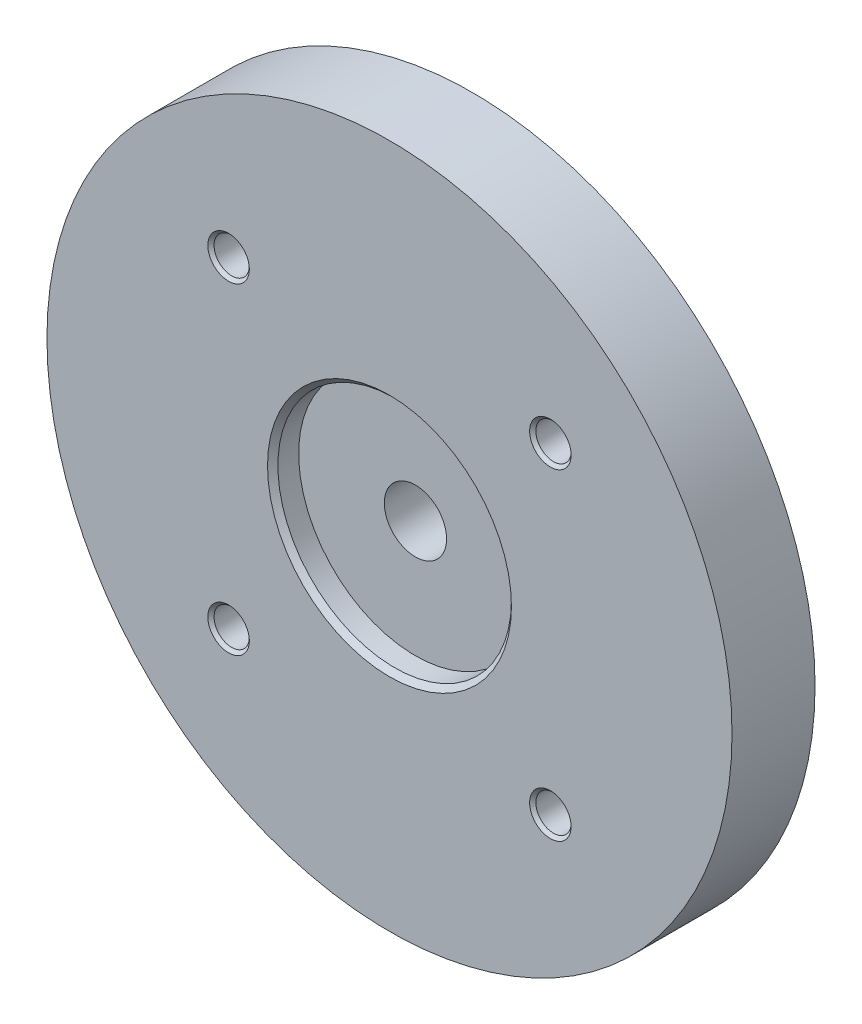
ISO-10303-21;
HEADER;
FILE_DESCRIPTION(('STEP AP214'),'2;1');
FILE_NAME('part.step','',(''),(''),'','','');
FILE_SCHEMA(('AUTOMOTIVE_DESIGN { 1 0 10303 214 1 1 1 1 }'));
ENDSEC;
DATA;
#1=APPLICATION_CONTEXT('core data for automotive mechanical design processes');
#2=APPLICATION_PROTOCOL_DEFINITION('international standard','automotive_design',2000,#1);
#3=PRODUCT_CONTEXT('',#1,'mechanical');
#4=PRODUCT('Part','Part','',(#3));
#5=PRODUCT_RELATED_PRODUCT_CATEGORY('part','',(#4));
#6=PRODUCT_DEFINITION_FORMATION('','',#4);
#7=PRODUCT_DEFINITION_CONTEXT('part definition',#1,'design');
#8=PRODUCT_DEFINITION('design','',#6,#7);
#9=PRODUCT_DEFINITION_SHAPE('','',#8);
#10=(LENGTH_UNIT() NAMED_UNIT(*) SI_UNIT(.MILLI.,.METRE.));
#11=(NAMED_UNIT(*) PLANE_ANGLE_UNIT() SI_UNIT($,.RADIAN.));
#12=(NAMED_UNIT(*) SI_UNIT($,.STERADIAN.) SOLID_ANGLE_UNIT());
#13=UNCERTAINTY_MEASURE_WITH_UNIT(LENGTH_MEASURE(1.E-05),#10,'distance_accuracy_value','');
#14=(GEOMETRIC_REPRESENTATION_CONTEXT(3) GLOBAL_UNCERTAINTY_ASSIGNED_CONTEXT((#13)) GLOBAL_UNIT_ASSIGNED_CONTEXT((#10,
#11,#12)) REPRESENTATION_CONTEXT('',''));
#15=CARTESIAN_POINT('',(0.,0.,0.));
#16=DIRECTION('',(0.,0.,1.));
#17=DIRECTION('',(1.,0.,0.));
#18=AXIS2_PLACEMENT_3D('',#15,#16,#17);
#19=CARTESIAN_POINT('',(0.,0.,-2.));
#20=DIRECTION('',(0.,0.,1.));
#21=DIRECTION('',(1.,0.,0.));
#22=AXIS2_PLACEMENT_3D('',#19,#20,#21);
#23=CYLINDRICAL_SURFACE('',#22,3.);
#24=CARTESIAN_POINT('',(0.,0.,-2.));
#25=DIRECTION('',(0.,0.,1.));
#26=DIRECTION('',(1.,0.,0.));
#27=AXIS2_PLACEMENT_3D('',#24,#25,#26);
#28=CIRCLE('',#27,3.);
#29=CARTESIAN_POINT('',(3.,0.,-2.));
#30=VERTEX_POINT('',#29);
#31=EDGE_CURVE('E112',#30,#30,#28,.T.);
#32=ORIENTED_EDGE('',*,*,#31,.F.);
#33=EDGE_LOOP('',(#32));
#34=FACE_BOUND('',#33,.T.);
#35=CARTESIAN_POINT('',(0.,0.,5.5));
#36=DIRECTION('',(0.,0.,1.));
#37=DIRECTION('',(1.,0.,0.));
#38=AXIS2_PLACEMENT_3D('',#35,#36,#37);
#39=CIRCLE('',#38,3.);
#40=CARTESIAN_POINT('',(3.,0.,5.5));
#41=VERTEX_POINT('',#40);
#42=EDGE_CURVE('E94',#41,#41,#39,.F.);
#43=ORIENTED_EDGE('',*,*,#42,.F.);
#44=EDGE_LOOP('',(#43));
#45=FACE_BOUND('',#44,.T.);
#46=ADVANCED_FACE('F44',(#34,#45),#23,.F.);
#47=CARTESIAN_POINT('',(-15.5,15.5,-2.));
#48=DIRECTION('',(0.,0.,1.));
#49=DIRECTION('',(1.,0.,0.));
#50=AXIS2_PLACEMENT_3D('',#47,#48,#49);
#51=CYLINDRICAL_SURFACE('',#50,1.7);
#52=CARTESIAN_POINT('',(-15.5,15.5,7.69999999999999));
#53=DIRECTION('',(0.,0.,1.));
#54=DIRECTION('',(1.,0.,0.));
#55=AXIS2_PLACEMENT_3D('',#52,#53,#54);
#56=CIRCLE('',#55,1.7);
#57=CARTESIAN_POINT('',(-13.8,15.5,7.69999999999999));
#58=VERTEX_POINT('',#57);
#59=EDGE_CURVE('E10',#58,#58,#56,.T.);
#60=ORIENTED_EDGE('',*,*,#59,.T.);
#61=EDGE_LOOP('',(#60));
#62=FACE_BOUND('',#61,.T.);
#63=CARTESIAN_POINT('',(-15.5,15.5,2.));
#64=DIRECTION('',(0.,0.,-1.));
#65=DIRECTION('',(-1.,0.,0.));
#66=AXIS2_PLACEMENT_3D('',#63,#64,#65);
#67=CIRCLE('',#66,1.7);
#68=CARTESIAN_POINT('',(-17.2,15.5,2.));
#69=VERTEX_POINT('',#68);
#70=EDGE_CURVE('E125',#69,#69,#67,.F.);
#71=ORIENTED_EDGE('',*,*,#70,.F.);
#72=EDGE_LOOP('',(#71));
#73=FACE_BOUND('',#72,.T.);
#74=ADVANCED_FACE('F225',(#62,#73),#51,.F.);
#75=CARTESIAN_POINT('',(15.5,15.5,-2.));
#76=DIRECTION('',(0.,0.,1.));
#77=DIRECTION('',(1.,0.,0.));
#78=AXIS2_PLACEMENT_3D('',#75,#76,#77);
#79=CYLINDRICAL_SURFACE('',#78,1.7);
#80=CARTESIAN_POINT('',(15.5,15.5,7.69999999999998));
#81=DIRECTION('',(0.,0.,1.));
#82=DIRECTION('',(1.,0.,0.));
#83=AXIS2_PLACEMENT_3D('',#80,#81,#82);
#84=CIRCLE('',#83,1.7);
#85=CARTESIAN_POINT('',(17.2,15.5,7.69999999999998));
#86=VERTEX_POINT('',#85);
#87=EDGE_CURVE('E53',#86,#86,#84,.T.);
#88=ORIENTED_EDGE('',*,*,#87,.T.);
#89=EDGE_LOOP('',(#88));
#90=FACE_BOUND('',#89,.T.);
#91=CARTESIAN_POINT('',(15.5,15.5,2.));
#92=DIRECTION('',(0.,0.,-1.));
#93=DIRECTION('',(-1.,0.,0.));
#94=AXIS2_PLACEMENT_3D('',#91,#92,#93);
#95=CIRCLE('',#94,1.7);
#96=CARTESIAN_POINT('',(13.8,15.5,2.));
#97=VERTEX_POINT('',#96);
#98=EDGE_CURVE('E129',#97,#97,#95,.F.);
#99=ORIENTED_EDGE('',*,*,#98,.F.);
#100=EDGE_LOOP('',(#99));
#101=FACE_BOUND('',#100,.T.);
#102=ADVANCED_FACE('F232',(#90,#101),#79,.F.);
#103=CARTESIAN_POINT('',(15.5,-15.5,-2.));
#104=DIRECTION('',(0.,0.,1.));
#105=DIRECTION('',(1.,0.,0.));
#106=AXIS2_PLACEMENT_3D('',#103,#104,#105);
#107=CYLINDRICAL_SURFACE('',#106,1.7);
#108=CARTESIAN_POINT('',(15.5,-15.5,7.69999999999998));
#109=DIRECTION('',(0.,0.,1.));
#110=DIRECTION('',(1.,0.,0.));
#111=AXIS2_PLACEMENT_3D('',#108,#109,#110);
#112=CIRCLE('',#111,1.7);
#113=CARTESIAN_POINT('',(17.2,-15.5,7.69999999999998));
#114=VERTEX_POINT('',#113);
#115=EDGE_CURVE('E58',#114,#114,#112,.T.);
#116=ORIENTED_EDGE('',*,*,#115,.T.);
#117=EDGE_LOOP('',(#116));
#118=FACE_BOUND('',#117,.T.);
#119=CARTESIAN_POINT('',(15.5,-15.5,2.));
#120=DIRECTION('',(0.,0.,-1.));
#121=DIRECTION('',(-1.,0.,0.));
#122=AXIS2_PLACEMENT_3D('',#119,#120,#121);
#123=CIRCLE('',#122,1.7);
#124=CARTESIAN_POINT('',(13.8,-15.5,2.));
#125=VERTEX_POINT('',#124);
#126=EDGE_CURVE('E133',#125,#125,#123,.F.);
#127=ORIENTED_EDGE('',*,*,#126,.F.);
#128=EDGE_LOOP('',(#127));
#129=FACE_BOUND('',#128,.T.);
#130=ADVANCED_FACE('F520',(#118,#129),#107,.F.);
#131=CARTESIAN_POINT('',(-15.5,-15.5,-2.));
#132=DIRECTION('',(0.,0.,1.));
#133=DIRECTION('',(1.,0.,0.));
#134=AXIS2_PLACEMENT_3D('',#131,#132,#133);
#135=CYLINDRICAL_SURFACE('',#134,1.7);
#136=CARTESIAN_POINT('',(-15.5,-15.5,7.69999999999998));
#137=DIRECTION('',(0.,0.,1.));
#138=DIRECTION('',(1.,0.,0.));
#139=AXIS2_PLACEMENT_3D('',#136,#137,#138);
#140=CIRCLE('',#139,1.7);
#141=CARTESIAN_POINT('',(-13.8,-15.5,7.69999999999998));
#142=VERTEX_POINT('',#141);
#143=EDGE_CURVE('E81',#142,#142,#140,.T.);
#144=ORIENTED_EDGE('',*,*,#143,.T.);
#145=EDGE_LOOP('',(#144));
#146=FACE_BOUND('',#145,.T.);
#147=CARTESIAN_POINT('',(-15.5,-15.5,2.));
#148=DIRECTION('',(0.,0.,-1.));
#149=DIRECTION('',(-1.,0.,0.));
#150=AXIS2_PLACEMENT_3D('',#147,#148,#149);
#151=CIRCLE('',#150,1.7);
#152=CARTESIAN_POINT('',(-17.2,-15.5,2.));
#153=VERTEX_POINT('',#152);
#154=EDGE_CURVE('E137',#153,#153,#151,.F.);
#155=ORIENTED_EDGE('',*,*,#154,.F.);
#156=EDGE_LOOP('',(#155));
#157=FACE_BOUND('',#156,.T.);
#158=ADVANCED_FACE('F237',(#146,#157),#135,.F.);
#159=CARTESIAN_POINT('',(0.,0.,8.));
#160=DIRECTION('',(0.,0.,-1.));
#161=DIRECTION('',(-1.,0.,0.));
#162=AXIS2_PLACEMENT_3D('',#159,#160,#161);
#163=CYLINDRICAL_SURFACE('',#162,33.);
#164=CARTESIAN_POINT('',(0.,0.,8.));
#165=DIRECTION('',(0.,0.,1.));
#166=DIRECTION('',(1.,0.,0.));
#167=AXIS2_PLACEMENT_3D('',#164,#165,#166);
#168=CIRCLE('',#167,33.);
#169=CARTESIAN_POINT('',(33.,0.,8.));
#170=VERTEX_POINT('',#169);
#171=EDGE_CURVE('E107',#170,#170,#168,.T.);
#172=ORIENTED_EDGE('',*,*,#171,.F.);
#173=EDGE_LOOP('',(#172));
#174=FACE_BOUND('',#173,.T.);
#175=CARTESIAN_POINT('',(0.,0.,0.));
#176=DIRECTION('',(0.,0.,1.));
#177=DIRECTION('',(1.,0.,0.));
#178=AXIS2_PLACEMENT_3D('',#175,#176,#177);
#179=CIRCLE('',#178,33.);
#180=CARTESIAN_POINT('',(33.,0.,0.));
#181=VERTEX_POINT('',#180);
#182=EDGE_CURVE('E142',#181,#181,#179,.T.);
#183=ORIENTED_EDGE('',*,*,#182,.T.);
#184=EDGE_LOOP('',(#183));
#185=FACE_BOUND('',#184,.T.);
#186=ADVANCED_FACE('F253',(#174,#185),#163,.T.);
#187=CARTESIAN_POINT('',(0.,0.,8.));
#188=DIRECTION('',(0.,0.,1.));
#189=DIRECTION('',(1.,0.,0.));
#190=AXIS2_PLACEMENT_3D('',#187,#188,#189);
#191=PLANE('',#190);
#192=CARTESIAN_POINT('',(-15.5,-15.5,8.));
#193=DIRECTION('',(0.,0.,1.));
#194=DIRECTION('',(1.,0.,0.));
#195=AXIS2_PLACEMENT_3D('',#192,#193,#194);
#196=CIRCLE('',#195,2.00000000000001);
#197=CARTESIAN_POINT('',(-13.5,-15.5,8.));
#198=VERTEX_POINT('',#197);
#199=EDGE_CURVE('E63',#198,#198,#196,.F.);
#200=ORIENTED_EDGE('',*,*,#199,.T.);
#201=EDGE_LOOP('',(#200));
#202=FACE_BOUND('',#201,.T.);
#203=CARTESIAN_POINT('',(15.5,-15.5,8.));
#204=DIRECTION('',(0.,0.,1.));
#205=DIRECTION('',(1.,0.,0.));
#206=AXIS2_PLACEMENT_3D('',#203,#204,#205);
#207=CIRCLE('',#206,2.00000000000002);
#208=CARTESIAN_POINT('',(17.5,-15.5,8.));
#209=VERTEX_POINT('',#208);
#210=EDGE_CURVE('E69',#209,#209,#207,.F.);
#211=ORIENTED_EDGE('',*,*,#210,.T.);
#212=EDGE_LOOP('',(#211));
#213=FACE_BOUND('',#212,.T.);
#214=CARTESIAN_POINT('',(15.5,15.5,8.));
#215=DIRECTION('',(0.,0.,1.));
#216=DIRECTION('',(1.,0.,0.));
#217=AXIS2_PLACEMENT_3D('',#214,#215,#216);
#218=CIRCLE('',#217,2.00000000000002);
#219=CARTESIAN_POINT('',(17.5,15.5,8.));
#220=VERTEX_POINT('',#219);
#221=EDGE_CURVE('E73',#220,#220,#218,.F.);
#222=ORIENTED_EDGE('',*,*,#221,.T.);
#223=EDGE_LOOP('',(#222));
#224=FACE_BOUND('',#223,.T.);
#225=CARTESIAN_POINT('',(-15.5,15.5,8.));
#226=DIRECTION('',(0.,0.,1.));
#227=DIRECTION('',(1.,0.,0.));
#228=AXIS2_PLACEMENT_3D('',#225,#226,#227);
#229=CIRCLE('',#228,2.00000000000002);
#230=CARTESIAN_POINT('',(-13.5,15.5,8.));
#231=VERTEX_POINT('',#230);
#232=EDGE_CURVE('E77',#231,#231,#229,.F.);
#233=ORIENTED_EDGE('',*,*,#232,.T.);
#234=EDGE_LOOP('',(#233));
#235=FACE_BOUND('',#234,.T.);
#236=CARTESIAN_POINT('',(0.,0.,8.));
#237=DIRECTION('',(0.,0.,1.));
#238=DIRECTION('',(1.,0.,0.));
#239=AXIS2_PLACEMENT_3D('',#236,#237,#238);
#240=CIRCLE('',#239,11.75);
#241=CARTESIAN_POINT('',(11.75,0.,8.));
#242=VERTEX_POINT('',#241);
#243=EDGE_CURVE('E85',#242,#242,#240,.F.);
#244=ORIENTED_EDGE('',*,*,#243,.T.);
#245=EDGE_LOOP('',(#244));
#246=FACE_BOUND('',#245,.T.);
#247=ORIENTED_EDGE('',*,*,#171,.T.);
#248=EDGE_LOOP('',(#247));
#249=FACE_BOUND('',#248,.T.);
#250=ADVANCED_FACE('F250',(#202,#213,#224,#235,#246,#249),#191,.T.);
#251=CARTESIAN_POINT('',(0.,0.,0.));
#252=DIRECTION('',(0.,0.,1.));
#253=DIRECTION('',(1.,0.,0.));
#254=AXIS2_PLACEMENT_3D('',#251,#252,#253);
#255=PLANE('',#254);
#256=CARTESIAN_POINT('',(0.,0.,0.));
#257=DIRECTION('',(0.,0.,1.));
#258=DIRECTION('',(1.,0.,0.));
#259=AXIS2_PLACEMENT_3D('',#256,#257,#258);
#260=CIRCLE('',#259,11.);
#261=CARTESIAN_POINT('',(11.,0.,0.));
#262=VERTEX_POINT('',#261);
#263=EDGE_CURVE('E93',#262,#262,#260,.T.);
#264=ORIENTED_EDGE('',*,*,#263,.T.);
#265=EDGE_LOOP('',(#264));
#266=FACE_BOUND('',#265,.T.);
#267=CARTESIAN_POINT('',(0.,29.5,0.));
#268=DIRECTION('',(0.,0.,-1.));
#269=DIRECTION('',(-1.,0.,0.));
#270=AXIS2_PLACEMENT_3D('',#267,#268,#269);
#271=CIRCLE('',#270,2.1);
#272=CARTESIAN_POINT('',(-2.1,29.5,0.));
#273=VERTEX_POINT('',#272);
#274=EDGE_CURVE('E195',#273,#273,#271,.T.);
#275=ORIENTED_EDGE('',*,*,#274,.F.);
#276=EDGE_LOOP('',(#275));
#277=FACE_BOUND('',#276,.T.);
#278=CARTESIAN_POINT('',(-29.5,-5.65519853168439E-13,0.));
#279=DIRECTION('',(0.,0.,-1.));
#280=DIRECTION('',(-1.,0.,0.));
#281=AXIS2_PLACEMENT_3D('',#278,#279,#280);
#282=CIRCLE('',#281,2.1);
#283=CARTESIAN_POINT('',(-31.6,-5.65519853168439E-13,0.));
#284=VERTEX_POINT('',#283);
#285=EDGE_CURVE('E191',#284,#284,#282,.T.);
#286=ORIENTED_EDGE('',*,*,#285,.F.);
#287=EDGE_LOOP('',(#286));
#288=FACE_BOUND('',#287,.T.);
#289=CARTESIAN_POINT('',(6.96595987118696E-13,-29.5,0.));
#290=DIRECTION('',(0.,0.,-1.));
#291=DIRECTION('',(-1.,0.,0.));
#292=AXIS2_PLACEMENT_3D('',#289,#290,#291);
#293=CIRCLE('',#292,2.1);
#294=CARTESIAN_POINT('',(-2.0999999999993,-29.5,0.));
#295=VERTEX_POINT('',#294);
#296=EDGE_CURVE('E183',#295,#295,#293,.T.);
#297=ORIENTED_EDGE('',*,*,#296,.F.);
#298=EDGE_LOOP('',(#297));
#299=FACE_BOUND('',#298,.T.);
#300=CARTESIAN_POINT('',(29.5000000000006,0.,0.));
#301=DIRECTION('',(0.,0.,-1.));
#302=DIRECTION('',(-1.,0.,0.));
#303=AXIS2_PLACEMENT_3D('',#300,#301,#302);
#304=CIRCLE('',#303,2.10000000000062);
#305=CARTESIAN_POINT('',(27.3999999999999,0.,0.));
#306=VERTEX_POINT('',#305);
#307=EDGE_CURVE('E175',#306,#306,#304,.T.);
#308=ORIENTED_EDGE('',*,*,#307,.F.);
#309=EDGE_LOOP('',(#308));
#310=FACE_BOUND('',#309,.T.);
#311=CARTESIAN_POINT('',(15.5,-15.5,0.));
#312=DIRECTION('',(0.,0.,1.));
#313=DIRECTION('',(1.,0.,0.));
#314=AXIS2_PLACEMENT_3D('',#311,#312,#313);
#315=CIRCLE('',#314,2.8);
#316=CARTESIAN_POINT('',(18.3,-15.5,0.));
#317=VERTEX_POINT('',#316);
#318=EDGE_CURVE('E108',#317,#317,#315,.F.);
#319=ORIENTED_EDGE('',*,*,#318,.F.);
#320=EDGE_LOOP('',(#319));
#321=FACE_BOUND('',#320,.T.);
#322=CARTESIAN_POINT('',(-15.5,-15.5,0.));
#323=DIRECTION('',(0.,0.,1.));
#324=DIRECTION('',(1.,0.,0.));
#325=AXIS2_PLACEMENT_3D('',#322,#323,#324);
#326=CIRCLE('',#325,2.8);
#327=CARTESIAN_POINT('',(-12.7,-15.5,0.));
#328=VERTEX_POINT('',#327);
#329=EDGE_CURVE('E113',#328,#328,#326,.F.);
#330=ORIENTED_EDGE('',*,*,#329,.F.);
#331=EDGE_LOOP('',(#330));
#332=FACE_BOUND('',#331,.T.);
#333=CARTESIAN_POINT('',(-15.5,15.5,0.));
#334=DIRECTION('',(0.,0.,1.));
#335=DIRECTION('',(1.,0.,0.));
#336=AXIS2_PLACEMENT_3D('',#333,#334,#335);
#337=CIRCLE('',#336,2.8);
#338=CARTESIAN_POINT('',(-12.7,15.5,0.));
#339=VERTEX_POINT('',#338);
#340=EDGE_CURVE('E117',#339,#339,#337,.F.);
#341=ORIENTED_EDGE('',*,*,#340,.F.);
#342=EDGE_LOOP('',(#341));
#343=FACE_BOUND('',#342,.T.);
#344=CARTESIAN_POINT('',(15.5,15.5,0.));
#345=DIRECTION('',(0.,0.,1.));
#346=DIRECTION('',(1.,0.,0.));
#347=AXIS2_PLACEMENT_3D('',#344,#345,#346);
#348=CIRCLE('',#347,2.8);
#349=CARTESIAN_POINT('',(18.3,15.5,0.));
#350=VERTEX_POINT('',#349);
#351=EDGE_CURVE('E121',#350,#350,#348,.F.);
#352=ORIENTED_EDGE('',*,*,#351,.F.);
#353=EDGE_LOOP('',(#352));
#354=FACE_BOUND('',#353,.T.);
#355=ORIENTED_EDGE('',*,*,#182,.F.);
#356=EDGE_LOOP('',(#355));
#357=FACE_BOUND('',#356,.T.);
#358=ADVANCED_FACE('F248',(#266,#277,#288,#299,#310,#321,#332,#343,#354,#357),#255,.F.);
#359=CARTESIAN_POINT('',(0.,0.,-2.));
#360=DIRECTION('',(0.,0.,1.));
#361=DIRECTION('',(1.,0.,0.));
#362=AXIS2_PLACEMENT_3D('',#359,#360,#361);
#363=CYLINDRICAL_SURFACE('',#362,10.);
#364=CARTESIAN_POINT('',(0.,0.,-1.));
#365=DIRECTION('',(0.,0.,1.));
#366=DIRECTION('',(1.,0.,0.));
#367=AXIS2_PLACEMENT_3D('',#364,#365,#366);
#368=CIRCLE('',#367,10.);
#369=CARTESIAN_POINT('',(10.,0.,-1.));
#370=VERTEX_POINT('',#369);
#371=EDGE_CURVE('E103',#370,#370,#368,.F.);
#372=ORIENTED_EDGE('',*,*,#371,.T.);
#373=EDGE_LOOP('',(#372));
#374=FACE_BOUND('',#373,.T.);
#375=CARTESIAN_POINT('',(0.,0.,-2.));
#376=DIRECTION('',(0.,0.,-1.));
#377=DIRECTION('',(-1.,0.,0.));
#378=AXIS2_PLACEMENT_3D('',#375,#376,#377);
#379=CIRCLE('',#378,10.);
#380=CARTESIAN_POINT('',(-10.,0.,-2.));
#381=VERTEX_POINT('',#380);
#382=EDGE_CURVE('E146',#381,#381,#379,.T.);
#383=ORIENTED_EDGE('',*,*,#382,.F.);
#384=EDGE_LOOP('',(#383));
#385=FACE_BOUND('',#384,.T.);
#386=ADVANCED_FACE('F244',(#374,#385),#363,.T.);
#387=CARTESIAN_POINT('',(0.,0.,-2.));
#388=DIRECTION('',(0.,0.,-1.));
#389=DIRECTION('',(-1.,0.,0.));
#390=AXIS2_PLACEMENT_3D('',#387,#388,#389);
#391=PLANE('',#390);
#392=ORIENTED_EDGE('',*,*,#31,.T.);
#393=EDGE_LOOP('',(#392));
#394=FACE_BOUND('',#393,.T.);
#395=ORIENTED_EDGE('',*,*,#382,.T.);
#396=EDGE_LOOP('',(#395));
#397=FACE_BOUND('',#396,.T.);
#398=ADVANCED_FACE('F240',(#394,#397),#391,.T.);
#399=CARTESIAN_POINT('',(-15.5,-15.5,-2.));
#400=DIRECTION('',(0.,0.,1.));
#401=DIRECTION('',(1.,0.,0.));
#402=AXIS2_PLACEMENT_3D('',#399,#400,#401);
#403=CYLINDRICAL_SURFACE('',#402,2.8);
#404=CARTESIAN_POINT('',(-15.5,-15.5,2.));
#405=DIRECTION('',(0.,0.,-1.));
#406=DIRECTION('',(-1.,0.,0.));
#407=AXIS2_PLACEMENT_3D('',#404,#405,#406);
#408=CIRCLE('',#407,2.8);
#409=CARTESIAN_POINT('',(-18.3,-15.5,2.));
#410=VERTEX_POINT('',#409);
#411=EDGE_CURVE('E164',#410,#410,#408,.T.);
#412=ORIENTED_EDGE('',*,*,#411,.F.);
#413=EDGE_LOOP('',(#412));
#414=FACE_BOUND('',#413,.T.);
#415=ORIENTED_EDGE('',*,*,#329,.T.);
#416=EDGE_LOOP('',(#415));
#417=FACE_BOUND('',#416,.T.);
#418=ADVANCED_FACE('F243',(#414,#417),#403,.F.);
#419=CARTESIAN_POINT('',(-15.5,-15.5,2.));
#420=DIRECTION('',(0.,0.,-1.));
#421=DIRECTION('',(-1.,0.,0.));
#422=AXIS2_PLACEMENT_3D('',#419,#420,#421);
#423=PLANE('',#422);
#424=ORIENTED_EDGE('',*,*,#411,.T.);
#425=EDGE_LOOP('',(#424));
#426=FACE_BOUND('',#425,.T.);
#427=ORIENTED_EDGE('',*,*,#154,.T.);
#428=EDGE_LOOP('',(#427));
#429=FACE_BOUND('',#428,.T.);
#430=ADVANCED_FACE('F487',(#426,#429),#423,.T.);
#431=CARTESIAN_POINT('',(15.5,-15.5,-2.));
#432=DIRECTION('',(0.,0.,1.));
#433=DIRECTION('',(1.,0.,0.));
#434=AXIS2_PLACEMENT_3D('',#431,#432,#433);
#435=CYLINDRICAL_SURFACE('',#434,2.8);
#436=CARTESIAN_POINT('',(15.5,-15.5,2.));
#437=DIRECTION('',(0.,0.,-1.));
#438=DIRECTION('',(-1.,0.,0.));
#439=AXIS2_PLACEMENT_3D('',#436,#437,#438);
#440=CIRCLE('',#439,2.8);
#441=CARTESIAN_POINT('',(12.7,-15.5,2.));
#442=VERTEX_POINT('',#441);
#443=EDGE_CURVE('E160',#442,#442,#440,.T.);
#444=ORIENTED_EDGE('',*,*,#443,.F.);
#445=EDGE_LOOP('',(#444));
#446=FACE_BOUND('',#445,.T.);
#447=ORIENTED_EDGE('',*,*,#318,.T.);
#448=EDGE_LOOP('',(#447));
#449=FACE_BOUND('',#448,.T.);
#450=ADVANCED_FACE('F477',(#446,#449),#435,.F.);
#451=CARTESIAN_POINT('',(15.5,-15.5,2.));
#452=DIRECTION('',(0.,0.,-1.));
#453=DIRECTION('',(-1.,0.,0.));
#454=AXIS2_PLACEMENT_3D('',#451,#452,#453);
#455=PLANE('',#454);
#456=ORIENTED_EDGE('',*,*,#443,.T.);
#457=EDGE_LOOP('',(#456));
#458=FACE_BOUND('',#457,.T.);
#459=ORIENTED_EDGE('',*,*,#126,.T.);
#460=EDGE_LOOP('',(#459));
#461=FACE_BOUND('',#460,.T.);
#462=ADVANCED_FACE('F467',(#458,#461),#455,.T.);
#463=CARTESIAN_POINT('',(15.5,15.5,-2.));
#464=DIRECTION('',(0.,0.,1.));
#465=DIRECTION('',(1.,0.,0.));
#466=AXIS2_PLACEMENT_3D('',#463,#464,#465);
#467=CYLINDRICAL_SURFACE('',#466,2.8);
#468=CARTESIAN_POINT('',(15.5,15.5,2.));
#469=DIRECTION('',(0.,0.,-1.));
#470=DIRECTION('',(-1.,0.,0.));
#471=AXIS2_PLACEMENT_3D('',#468,#469,#470);
#472=CIRCLE('',#471,2.8);
#473=CARTESIAN_POINT('',(12.7,15.5,2.));
#474=VERTEX_POINT('',#473);
#475=EDGE_CURVE('E141',#474,#474,#472,.T.);
#476=ORIENTED_EDGE('',*,*,#475,.F.);
#477=EDGE_LOOP('',(#476));
#478=FACE_BOUND('',#477,.T.);
#479=ORIENTED_EDGE('',*,*,#351,.T.);
#480=EDGE_LOOP('',(#479));
#481=FACE_BOUND('',#480,.T.);
#482=ADVANCED_FACE('F457',(#478,#481),#467,.F.);
#483=CARTESIAN_POINT('',(15.5,15.5,2.));
#484=DIRECTION('',(0.,0.,-1.));
#485=DIRECTION('',(-1.,0.,0.));
#486=AXIS2_PLACEMENT_3D('',#483,#484,#485);
#487=PLANE('',#486);
#488=ORIENTED_EDGE('',*,*,#475,.T.);
#489=EDGE_LOOP('',(#488));
#490=FACE_BOUND('',#489,.T.);
#491=ORIENTED_EDGE('',*,*,#98,.T.);
#492=EDGE_LOOP('',(#491));
#493=FACE_BOUND('',#492,.T.);
#494=ADVANCED_FACE('F447',(#490,#493),#487,.T.);
#495=CARTESIAN_POINT('',(-15.5,15.5,-2.));
#496=DIRECTION('',(0.,0.,1.));
#497=DIRECTION('',(1.,0.,0.));
#498=AXIS2_PLACEMENT_3D('',#495,#496,#497);
#499=CYLINDRICAL_SURFACE('',#498,2.8);
#500=CARTESIAN_POINT('',(-15.5,15.5,2.));
#501=DIRECTION('',(0.,0.,-1.));
#502=DIRECTION('',(-1.,0.,0.));
#503=AXIS2_PLACEMENT_3D('',#500,#501,#502);
#504=CIRCLE('',#503,2.8);
#505=CARTESIAN_POINT('',(-18.3,15.5,2.));
#506=VERTEX_POINT('',#505);
#507=EDGE_CURVE('E159',#506,#506,#504,.T.);
#508=ORIENTED_EDGE('',*,*,#507,.F.);
#509=EDGE_LOOP('',(#508));
#510=FACE_BOUND('',#509,.T.);
#511=ORIENTED_EDGE('',*,*,#340,.T.);
#512=EDGE_LOOP('',(#511));
#513=FACE_BOUND('',#512,.T.);
#514=ADVANCED_FACE('F437',(#510,#513),#499,.F.);
#515=CARTESIAN_POINT('',(-15.5,15.5,2.));
#516=DIRECTION('',(0.,0.,-1.));
#517=DIRECTION('',(-1.,0.,0.));
#518=AXIS2_PLACEMENT_3D('',#515,#516,#517);
#519=PLANE('',#518);
#520=ORIENTED_EDGE('',*,*,#507,.T.);
#521=EDGE_LOOP('',(#520));
#522=FACE_BOUND('',#521,.T.);
#523=ORIENTED_EDGE('',*,*,#70,.T.);
#524=EDGE_LOOP('',(#523));
#525=FACE_BOUND('',#524,.T.);
#526=ADVANCED_FACE('F427',(#522,#525),#519,.T.);
#527=CARTESIAN_POINT('',(29.5000000000006,0.,6.));
#528=DIRECTION('',(0.,0.,-1.));
#529=DIRECTION('',(-1.,0.,0.));
#530=AXIS2_PLACEMENT_3D('',#527,#528,#529);
#531=CYLINDRICAL_SURFACE('',#530,2.10000000000062);
#532=CARTESIAN_POINT('',(29.5000000000006,0.,6.));
#533=DIRECTION('',(0.,0.,-1.));
#534=DIRECTION('',(-1.,0.,0.));
#535=AXIS2_PLACEMENT_3D('',#532,#533,#534);
#536=CIRCLE('',#535,2.10000000000062);
#537=CARTESIAN_POINT('',(27.3999999999999,0.,6.));
#538=VERTEX_POINT('',#537);
#539=EDGE_CURVE('E98',#538,#538,#536,.T.);
#540=ORIENTED_EDGE('',*,*,#539,.F.);
#541=EDGE_LOOP('',(#540));
#542=FACE_BOUND('',#541,.T.);
#543=ORIENTED_EDGE('',*,*,#307,.T.);
#544=EDGE_LOOP('',(#543));
#545=FACE_BOUND('',#544,.T.);
#546=ADVANCED_FACE('F417',(#542,#545),#531,.F.);
#547=CARTESIAN_POINT('',(29.5000000000006,0.,6.));
#548=DIRECTION('',(0.,0.,-1.));
#549=DIRECTION('',(-1.,0.,0.));
#550=AXIS2_PLACEMENT_3D('',#547,#548,#549);
#551=PLANE('',#550);
#552=ORIENTED_EDGE('',*,*,#539,.T.);
#553=EDGE_LOOP('',(#552));
#554=FACE_BOUND('',#553,.T.);
#555=ADVANCED_FACE('F407',(#554),#551,.T.);
#556=CARTESIAN_POINT('',(6.96595987118696E-13,-29.5,6.));
#557=DIRECTION('',(0.,0.,-1.));
#558=DIRECTION('',(-1.,0.,0.));
#559=AXIS2_PLACEMENT_3D('',#556,#557,#558);
#560=CYLINDRICAL_SURFACE('',#559,2.1);
#561=CARTESIAN_POINT('',(6.96595987118696E-13,-29.5,6.));
#562=DIRECTION('',(0.,0.,-1.));
#563=DIRECTION('',(-1.,0.,0.));
#564=AXIS2_PLACEMENT_3D('',#561,#562,#563);
#565=CIRCLE('',#564,2.1);
#566=CARTESIAN_POINT('',(-2.0999999999993,-29.5,6.));
#567=VERTEX_POINT('',#566);
#568=EDGE_CURVE('E179',#567,#567,#565,.T.);
#569=ORIENTED_EDGE('',*,*,#568,.F.);
#570=EDGE_LOOP('',(#569));
#571=FACE_BOUND('',#570,.T.);
#572=ORIENTED_EDGE('',*,*,#296,.T.);
#573=EDGE_LOOP('',(#572));
#574=FACE_BOUND('',#573,.T.);
#575=ADVANCED_FACE('F397',(#571,#574),#560,.F.);
#576=CARTESIAN_POINT('',(6.96595987118696E-13,-29.5,6.));
#577=DIRECTION('',(0.,0.,-1.));
#578=DIRECTION('',(-1.,0.,0.));
#579=AXIS2_PLACEMENT_3D('',#576,#577,#578);
#580=PLANE('',#579);
#581=ORIENTED_EDGE('',*,*,#568,.T.);
#582=EDGE_LOOP('',(#581));
#583=FACE_BOUND('',#582,.T.);
#584=ADVANCED_FACE('F387',(#583),#580,.T.);
#585=CARTESIAN_POINT('',(-29.5,-5.65519853168439E-13,6.));
#586=DIRECTION('',(0.,0.,-1.));
#587=DIRECTION('',(-1.,0.,0.));
#588=AXIS2_PLACEMENT_3D('',#585,#586,#587);
#589=CYLINDRICAL_SURFACE('',#588,2.1);
#590=CARTESIAN_POINT('',(-29.5,-5.65519853168439E-13,6.));
#591=DIRECTION('',(0.,0.,-1.));
#592=DIRECTION('',(-1.,0.,0.));
#593=AXIS2_PLACEMENT_3D('',#590,#591,#592);
#594=CIRCLE('',#593,2.1);
#595=CARTESIAN_POINT('',(-31.6,-5.65519853168439E-13,6.));
#596=VERTEX_POINT('',#595);
#597=EDGE_CURVE('E187',#596,#596,#594,.T.);
#598=ORIENTED_EDGE('',*,*,#597,.F.);
#599=EDGE_LOOP('',(#598));
#600=FACE_BOUND('',#599,.T.);
#601=ORIENTED_EDGE('',*,*,#285,.T.);
#602=EDGE_LOOP('',(#601));
#603=FACE_BOUND('',#602,.T.);
#604=ADVANCED_FACE('F377',(#600,#603),#589,.F.);
#605=CARTESIAN_POINT('',(-29.5,-5.65519853168439E-13,6.));
#606=DIRECTION('',(0.,0.,-1.));
#607=DIRECTION('',(-1.,0.,0.));
#608=AXIS2_PLACEMENT_3D('',#605,#606,#607);
#609=PLANE('',#608);
#610=ORIENTED_EDGE('',*,*,#597,.T.);
#611=EDGE_LOOP('',(#610));
#612=FACE_BOUND('',#611,.T.);
#613=ADVANCED_FACE('F367',(#612),#609,.T.);
#614=CARTESIAN_POINT('',(0.,29.5,6.));
#615=DIRECTION('',(0.,0.,-1.));
#616=DIRECTION('',(-1.,0.,0.));
#617=AXIS2_PLACEMENT_3D('',#614,#615,#616);
#618=CYLINDRICAL_SURFACE('',#617,2.1);
#619=CARTESIAN_POINT('',(0.,29.5,6.));
#620=DIRECTION('',(0.,0.,-1.));
#621=DIRECTION('',(-1.,0.,0.));
#622=AXIS2_PLACEMENT_3D('',#619,#620,#621);
#623=CIRCLE('',#622,2.1);
#624=CARTESIAN_POINT('',(-2.1,29.5,6.));
#625=VERTEX_POINT('',#624);
#626=EDGE_CURVE('E165',#625,#625,#623,.T.);
#627=ORIENTED_EDGE('',*,*,#626,.F.);
#628=EDGE_LOOP('',(#627));
#629=FACE_BOUND('',#628,.T.);
#630=ORIENTED_EDGE('',*,*,#274,.T.);
#631=EDGE_LOOP('',(#630));
#632=FACE_BOUND('',#631,.T.);
#633=ADVANCED_FACE('F358',(#629,#632),#618,.F.);
#634=CARTESIAN_POINT('',(0.,29.5,6.));
#635=DIRECTION('',(0.,0.,-1.));
#636=DIRECTION('',(-1.,0.,0.));
#637=AXIS2_PLACEMENT_3D('',#634,#635,#636);
#638=PLANE('',#637);
#639=ORIENTED_EDGE('',*,*,#626,.T.);
#640=EDGE_LOOP('',(#639));
#641=FACE_BOUND('',#640,.T.);
#642=ADVANCED_FACE('F261',(#641),#638,.T.);
#643=CARTESIAN_POINT('',(0.,0.,-1.));
#644=DIRECTION('',(0.,0.,1.));
#645=DIRECTION('',(1.,0.,0.));
#646=AXIS2_PLACEMENT_3D('',#643,#644,#645);
#647=TOROIDAL_SURFACE('',#646,11.,1.);
#648=ORIENTED_EDGE('',*,*,#263,.F.);
#649=EDGE_LOOP('',(#648));
#650=FACE_BOUND('',#649,.T.);
#651=ORIENTED_EDGE('',*,*,#371,.F.);
#652=EDGE_LOOP('',(#651));
#653=FACE_BOUND('',#652,.T.);
#654=ADVANCED_FACE('F221',(#650,#653),#647,.F.);
#655=CARTESIAN_POINT('',(0.,0.,5.5));
#656=DIRECTION('',(0.,0.,1.));
#657=DIRECTION('',(1.,0.,0.));
#658=AXIS2_PLACEMENT_3D('',#655,#656,#657);
#659=PLANE('',#658);
#660=CARTESIAN_POINT('',(0.,0.,5.5));
#661=DIRECTION('',(0.,0.,1.));
#662=DIRECTION('',(1.,0.,0.));
#663=AXIS2_PLACEMENT_3D('',#660,#661,#662);
#664=CIRCLE('',#663,11.25);
#665=CARTESIAN_POINT('',(11.25,0.,5.5));
#666=VERTEX_POINT('',#665);
#667=EDGE_CURVE('E99',#666,#666,#664,.T.);
#668=ORIENTED_EDGE('',*,*,#667,.T.);
#669=EDGE_LOOP('',(#668));
#670=FACE_BOUND('',#669,.T.);
#671=ORIENTED_EDGE('',*,*,#42,.T.);
#672=EDGE_LOOP('',(#671));
#673=FACE_BOUND('',#672,.T.);
#674=ADVANCED_FACE('F206',(#670,#673),#659,.T.);
#675=CARTESIAN_POINT('',(0.,0.,5.5));
#676=DIRECTION('',(0.,0.,1.));
#677=DIRECTION('',(1.,0.,0.));
#678=AXIS2_PLACEMENT_3D('',#675,#676,#677);
#679=CYLINDRICAL_SURFACE('',#678,11.25);
#680=CARTESIAN_POINT('',(0.,0.,7.49999999999999));
#681=DIRECTION('',(0.,0.,1.));
#682=DIRECTION('',(1.,0.,0.));
#683=AXIS2_PLACEMENT_3D('',#680,#681,#682);
#684=CIRCLE('',#683,11.25);
#685=CARTESIAN_POINT('',(11.25,0.,7.49999999999999));
#686=VERTEX_POINT('',#685);
#687=EDGE_CURVE('E89',#686,#686,#684,.T.);
#688=ORIENTED_EDGE('',*,*,#687,.T.);
#689=EDGE_LOOP('',(#688));
#690=FACE_BOUND('',#689,.T.);
#691=ORIENTED_EDGE('',*,*,#667,.F.);
#692=EDGE_LOOP('',(#691));
#693=FACE_BOUND('',#692,.T.);
#694=ADVANCED_FACE('F209',(#690,#693),#679,.F.);
#695=CARTESIAN_POINT('',(0.,0.,7.49999999999999));
#696=DIRECTION('',(0.,0.,1.));
#697=DIRECTION('',(1.,0.,0.));
#698=AXIS2_PLACEMENT_3D('',#695,#696,#697);
#699=CONICAL_SURFACE('',#698,11.25,0.785398163397434);
#700=ORIENTED_EDGE('',*,*,#243,.F.);
#701=EDGE_LOOP('',(#700));
#702=FACE_BOUND('',#701,.T.);
#703=ORIENTED_EDGE('',*,*,#687,.F.);
#704=EDGE_LOOP('',(#703));
#705=FACE_BOUND('',#704,.T.);
#706=ADVANCED_FACE('F211',(#702,#705),#699,.F.);
#707=CARTESIAN_POINT('',(-15.5,-15.5,7.69999999999998));
#708=DIRECTION('',(0.,0.,1.));
#709=DIRECTION('',(1.,0.,0.));
#710=AXIS2_PLACEMENT_3D('',#707,#708,#709);
#711=CONICAL_SURFACE('',#710,1.7,0.785398163397444);
#712=ORIENTED_EDGE('',*,*,#199,.F.);
#713=EDGE_LOOP('',(#712));
#714=FACE_BOUND('',#713,.T.);
#715=ORIENTED_EDGE('',*,*,#143,.F.);
#716=EDGE_LOOP('',(#715));
#717=FACE_BOUND('',#716,.T.);
#718=ADVANCED_FACE('F218',(#714,#717),#711,.F.);
#719=CARTESIAN_POINT('',(15.5,-15.5,7.69999999999998));
#720=DIRECTION('',(0.,0.,1.));
#721=DIRECTION('',(1.,0.,0.));
#722=AXIS2_PLACEMENT_3D('',#719,#720,#721);
#723=CONICAL_SURFACE('',#722,1.7,0.785398163397453);
#724=ORIENTED_EDGE('',*,*,#210,.F.);
#725=EDGE_LOOP('',(#724));
#726=FACE_BOUND('',#725,.T.);
#727=ORIENTED_EDGE('',*,*,#115,.F.);
#728=EDGE_LOOP('',(#727));
#729=FACE_BOUND('',#728,.T.);
#730=ADVANCED_FACE('F273',(#726,#729),#723,.F.);
#731=CARTESIAN_POINT('',(15.5,15.5,7.69999999999998));
#732=DIRECTION('',(0.,0.,1.));
#733=DIRECTION('',(1.,0.,0.));
#734=AXIS2_PLACEMENT_3D('',#731,#732,#733);
#735=CONICAL_SURFACE('',#734,1.7,0.785398163397447);
#736=ORIENTED_EDGE('',*,*,#221,.F.);
#737=EDGE_LOOP('',(#736));
#738=FACE_BOUND('',#737,.T.);
#739=ORIENTED_EDGE('',*,*,#87,.F.);
#740=EDGE_LOOP('',(#739));
#741=FACE_BOUND('',#740,.T.);
#742=ADVANCED_FACE('F279',(#738,#741),#735,.F.);
#743=CARTESIAN_POINT('',(-15.5,15.5,7.69999999999999));
#744=DIRECTION('',(0.,0.,1.));
#745=DIRECTION('',(1.,0.,0.));
#746=AXIS2_PLACEMENT_3D('',#743,#744,#745);
#747=CONICAL_SURFACE('',#746,1.7,0.785398163397449);
#748=ORIENTED_EDGE('',*,*,#232,.F.);
#749=EDGE_LOOP('',(#748));
#750=FACE_BOUND('',#749,.T.);
#751=ORIENTED_EDGE('',*,*,#59,.F.);
#752=EDGE_LOOP('',(#751));
#753=FACE_BOUND('',#752,.T.);
#754=ADVANCED_FACE('F47',(#750,#753),#747,.F.);
#755=CLOSED_SHELL('',(#46,#74,#102,#130,#158,#186,#250,#358,#386,#398,#418,#430,#450,#462,#482,
#494,#514,#526,#546,#555,#575,#584,#604,#613,#633,#642,#654,#674,#694,#706,#718,#730,#742,#754));
#756=MANIFOLD_SOLID_BREP('B2',#755);
#757=ADVANCED_BREP_SHAPE_REPRESENTATION('',(#18,#756),#14);
#758=SHAPE_DEFINITION_REPRESENTATION(#9,#757);
ENDSEC;
END-ISO-10303-21;
